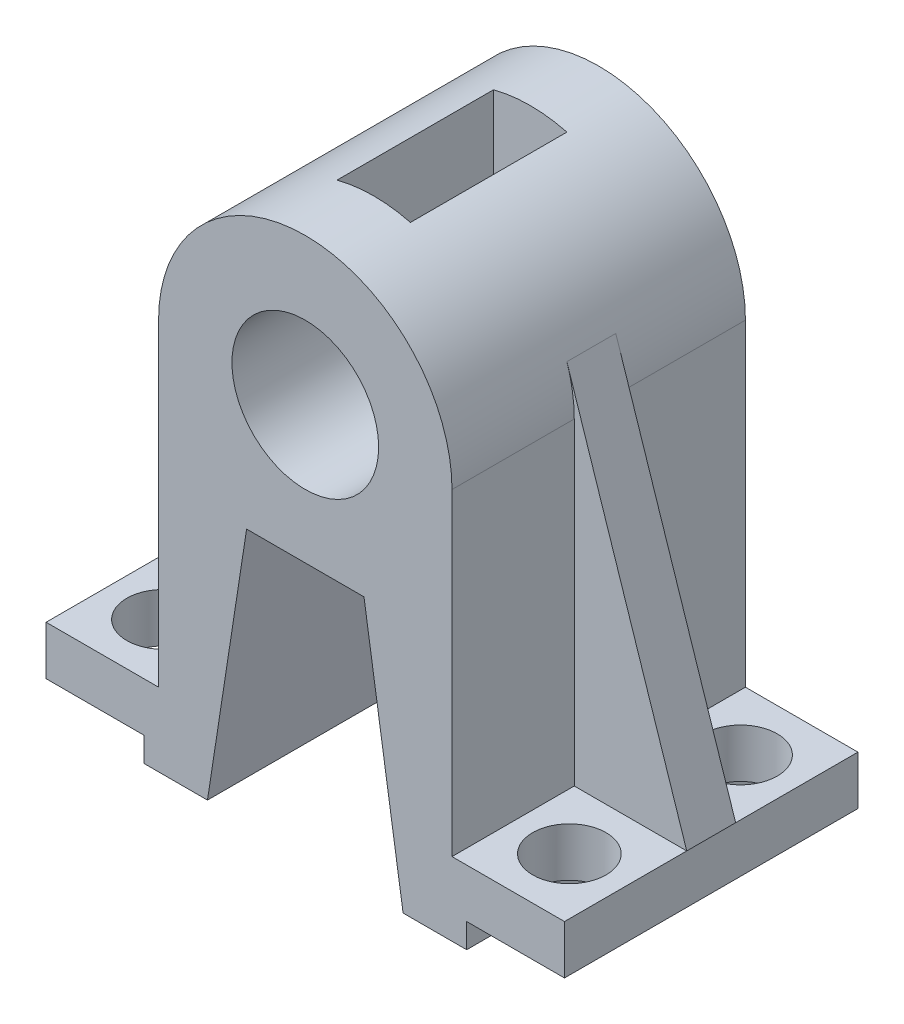
ISO-10303-21;
HEADER;
FILE_DESCRIPTION(('STEP AP214'),'2;1');
FILE_NAME('part.step','',(''),(''),'','','');
FILE_SCHEMA(('AUTOMOTIVE_DESIGN { 1 0 10303 214 1 1 1 1 }'));
ENDSEC;
DATA;
#1=APPLICATION_CONTEXT('core data for automotive mechanical design processes');
#2=APPLICATION_PROTOCOL_DEFINITION('international standard','automotive_design',2000,#1);
#3=PRODUCT_CONTEXT('',#1,'mechanical');
#4=PRODUCT('Part','Part','',(#3));
#5=PRODUCT_RELATED_PRODUCT_CATEGORY('part','',(#4));
#6=PRODUCT_DEFINITION_FORMATION('','',#4);
#7=PRODUCT_DEFINITION_CONTEXT('part definition',#1,'design');
#8=PRODUCT_DEFINITION('design','',#6,#7);
#9=PRODUCT_DEFINITION_SHAPE('','',#8);
#10=(LENGTH_UNIT() NAMED_UNIT(*) SI_UNIT(.MILLI.,.METRE.));
#11=(NAMED_UNIT(*) PLANE_ANGLE_UNIT() SI_UNIT($,.RADIAN.));
#12=(NAMED_UNIT(*) SI_UNIT($,.STERADIAN.) SOLID_ANGLE_UNIT());
#13=UNCERTAINTY_MEASURE_WITH_UNIT(LENGTH_MEASURE(1.E-05),#10,'distance_accuracy_value','');
#14=(GEOMETRIC_REPRESENTATION_CONTEXT(3) GLOBAL_UNCERTAINTY_ASSIGNED_CONTEXT((#13)) GLOBAL_UNIT_ASSIGNED_CONTEXT((#10,
#11,#12)) REPRESENTATION_CONTEXT('',''));
#15=CARTESIAN_POINT('',(0.,0.,0.));
#16=DIRECTION('',(0.,0.,1.));
#17=DIRECTION('',(1.,0.,0.));
#18=AXIS2_PLACEMENT_3D('',#15,#16,#17);
#19=CARTESIAN_POINT('',(-30.,15.,60.));
#20=DIRECTION('',(1.,0.,0.));
#21=DIRECTION('',(0.,0.,-1.));
#22=AXIS2_PLACEMENT_3D('',#19,#20,#21);
#23=PLANE('',#22);
#24=DIRECTION('',(0.,-1.,0.));
#25=VECTOR('',#24,1.);
#26=CARTESIAN_POINT('',(-30.,15.,25.));
#27=LINE('',#26,#25);
#28=CARTESIAN_POINT('',(-30.,80.,25.));
#29=VERTEX_POINT('',#28);
#30=CARTESIAN_POINT('',(-30.,15.,25.));
#31=VERTEX_POINT('',#30);
#32=EDGE_CURVE('E255',#29,#31,#27,.T.);
#33=ORIENTED_EDGE('',*,*,#32,.F.);
#34=DIRECTION('',(0.,0.,-1.));
#35=VECTOR('',#34,1.);
#36=CARTESIAN_POINT('',(-30.,80.,60.));
#37=LINE('',#36,#35);
#38=CARTESIAN_POINT('',(-30.,80.,0.));
#39=VERTEX_POINT('',#38);
#40=EDGE_CURVE('E252',#29,#39,#37,.T.);
#41=ORIENTED_EDGE('',*,*,#40,.T.);
#42=DIRECTION('',(0.,-1.,0.));
#43=VECTOR('',#42,1.);
#44=CARTESIAN_POINT('',(-30.,15.,0.));
#45=LINE('',#44,#43);
#46=CARTESIAN_POINT('',(-30.,15.,0.));
#47=VERTEX_POINT('',#46);
#48=EDGE_CURVE('E433',#39,#47,#45,.T.);
#49=ORIENTED_EDGE('',*,*,#48,.T.);
#50=DIRECTION('',(0.,0.,-1.));
#51=VECTOR('',#50,1.);
#52=CARTESIAN_POINT('',(-30.,15.,60.));
#53=LINE('',#52,#51);
#54=EDGE_CURVE('E507',#31,#47,#53,.T.);
#55=ORIENTED_EDGE('',*,*,#54,.F.);
#56=EDGE_LOOP('',(#33,#41,#49,#55));
#57=FACE_BOUND('',#56,.T.);
#58=ADVANCED_FACE('F45',(#57),#23,.F.);
#59=CARTESIAN_POINT('',(-53.,15.,60.));
#60=DIRECTION('',(0.,-1.,0.));
#61=DIRECTION('',(1.,0.,0.));
#62=AXIS2_PLACEMENT_3D('',#59,#60,#61);
#63=PLANE('',#62);
#64=CARTESIAN_POINT('',(-41.5,15.,12.5));
#65=DIRECTION('',(0.,1.,0.));
#66=DIRECTION('',(-1.,0.,0.));
#67=AXIS2_PLACEMENT_3D('',#64,#65,#66);
#68=CIRCLE('',#67,7.5);
#69=CARTESIAN_POINT('',(-49.,15.,12.5));
#70=VERTEX_POINT('',#69);
#71=EDGE_CURVE('E334',#70,#70,#68,.T.);
#72=ORIENTED_EDGE('',*,*,#71,.F.);
#73=EDGE_LOOP('',(#72));
#74=FACE_BOUND('',#73,.T.);
#75=DIRECTION('',(-1.,0.,0.));
#76=VECTOR('',#75,1.);
#77=CARTESIAN_POINT('',(-53.,15.,25.));
#78=LINE('',#77,#76);
#79=CARTESIAN_POINT('',(-53.,15.,25.));
#80=VERTEX_POINT('',#79);
#81=EDGE_CURVE('E245',#31,#80,#78,.T.);
#82=ORIENTED_EDGE('',*,*,#81,.F.);
#83=ORIENTED_EDGE('',*,*,#54,.T.);
#84=DIRECTION('',(-1.,0.,0.));
#85=VECTOR('',#84,1.);
#86=CARTESIAN_POINT('',(-53.,15.,0.));
#87=LINE('',#86,#85);
#88=CARTESIAN_POINT('',(-53.,15.,0.));
#89=VERTEX_POINT('',#88);
#90=EDGE_CURVE('E437',#47,#89,#87,.T.);
#91=ORIENTED_EDGE('',*,*,#90,.T.);
#92=DIRECTION('',(0.,0.,-1.));
#93=VECTOR('',#92,1.);
#94=CARTESIAN_POINT('',(-53.,15.,60.));
#95=LINE('',#94,#93);
#96=EDGE_CURVE('E502',#80,#89,#95,.T.);
#97=ORIENTED_EDGE('',*,*,#96,.F.);
#98=EDGE_LOOP('',(#82,#83,#91,#97));
#99=FACE_BOUND('',#98,.T.);
#100=ADVANCED_FACE('F586',(#74,#99),#63,.F.);
#101=CARTESIAN_POINT('',(53.,15.,60.));
#102=DIRECTION('',(0.,-1.,0.));
#103=DIRECTION('',(1.,0.,0.));
#104=AXIS2_PLACEMENT_3D('',#101,#102,#103);
#105=PLANE('',#104);
#106=CARTESIAN_POINT('',(41.5,15.,12.5));
#107=DIRECTION('',(0.,1.,0.));
#108=DIRECTION('',(1.,0.,0.));
#109=AXIS2_PLACEMENT_3D('',#106,#107,#108);
#110=CIRCLE('',#109,7.5);
#111=CARTESIAN_POINT('',(49.,15.,12.5));
#112=VERTEX_POINT('',#111);
#113=EDGE_CURVE('E329',#112,#112,#110,.T.);
#114=ORIENTED_EDGE('',*,*,#113,.F.);
#115=EDGE_LOOP('',(#114));
#116=FACE_BOUND('',#115,.T.);
#117=DIRECTION('',(-1.,0.,0.));
#118=VECTOR('',#117,1.);
#119=CARTESIAN_POINT('',(53.,15.,25.));
#120=LINE('',#119,#118);
#121=CARTESIAN_POINT('',(53.,15.,25.));
#122=VERTEX_POINT('',#121);
#123=CARTESIAN_POINT('',(30.,15.,25.));
#124=VERTEX_POINT('',#123);
#125=EDGE_CURVE('E287',#122,#124,#120,.T.);
#126=ORIENTED_EDGE('',*,*,#125,.F.);
#127=DIRECTION('',(0.,0.,-1.));
#128=VECTOR('',#127,1.);
#129=CARTESIAN_POINT('',(53.,15.,60.));
#130=LINE('',#129,#128);
#131=CARTESIAN_POINT('',(53.,15.,0.));
#132=VERTEX_POINT('',#131);
#133=EDGE_CURVE('E526',#122,#132,#130,.T.);
#134=ORIENTED_EDGE('',*,*,#133,.T.);
#135=DIRECTION('',(-1.,0.,0.));
#136=VECTOR('',#135,1.);
#137=CARTESIAN_POINT('',(53.,15.,0.));
#138=LINE('',#137,#136);
#139=CARTESIAN_POINT('',(30.,15.,0.));
#140=VERTEX_POINT('',#139);
#141=EDGE_CURVE('E422',#132,#140,#138,.T.);
#142=ORIENTED_EDGE('',*,*,#141,.T.);
#143=DIRECTION('',(0.,0.,-1.));
#144=VECTOR('',#143,1.);
#145=CARTESIAN_POINT('',(30.,15.,60.));
#146=LINE('',#145,#144);
#147=EDGE_CURVE('E521',#124,#140,#146,.T.);
#148=ORIENTED_EDGE('',*,*,#147,.F.);
#149=EDGE_LOOP('',(#126,#134,#142,#148));
#150=FACE_BOUND('',#149,.T.);
#151=ADVANCED_FACE('F594',(#116,#150),#105,.F.);
#152=CARTESIAN_POINT('',(30.,15.,60.));
#153=DIRECTION('',(-1.,0.,0.));
#154=DIRECTION('',(0.,0.,1.));
#155=AXIS2_PLACEMENT_3D('',#152,#153,#154);
#156=PLANE('',#155);
#157=DIRECTION('',(0.,1.,0.));
#158=VECTOR('',#157,1.);
#159=CARTESIAN_POINT('',(30.,15.,25.));
#160=LINE('',#159,#158);
#161=CARTESIAN_POINT('',(30.,80.,25.));
#162=VERTEX_POINT('',#161);
#163=EDGE_CURVE('E283',#124,#162,#160,.T.);
#164=ORIENTED_EDGE('',*,*,#163,.F.);
#165=ORIENTED_EDGE('',*,*,#147,.T.);
#166=DIRECTION('',(0.,1.,0.));
#167=VECTOR('',#166,1.);
#168=CARTESIAN_POINT('',(30.,15.,0.));
#169=LINE('',#168,#167);
#170=CARTESIAN_POINT('',(30.,80.,0.));
#171=VERTEX_POINT('',#170);
#172=EDGE_CURVE('E426',#140,#171,#169,.T.);
#173=ORIENTED_EDGE('',*,*,#172,.T.);
#174=DIRECTION('',(0.,0.,-1.));
#175=VECTOR('',#174,1.);
#176=CARTESIAN_POINT('',(30.,80.,60.));
#177=LINE('',#176,#175);
#178=EDGE_CURVE('E517',#162,#171,#177,.T.);
#179=ORIENTED_EDGE('',*,*,#178,.F.);
#180=EDGE_LOOP('',(#164,#165,#173,#179));
#181=FACE_BOUND('',#180,.T.);
#182=ADVANCED_FACE('F612',(#181),#156,.F.);
#183=CARTESIAN_POINT('',(0.,80.,60.));
#184=DIRECTION('',(0.,0.,-1.));
#185=DIRECTION('',(-1.,0.,0.));
#186=AXIS2_PLACEMENT_3D('',#183,#184,#185);
#187=CYLINDRICAL_SURFACE('',#186,30.);
#188=CARTESIAN_POINT('',(0.,80.,14.));
#189=DIRECTION('',(0.,0.,1.));
#190=DIRECTION('',(1.,0.,0.));
#191=AXIS2_PLACEMENT_3D('',#188,#189,#190);
#192=CIRCLE('',#191,30.);
#193=CARTESIAN_POINT('',(7.5,109.047375096556,14.));
#194=VERTEX_POINT('',#193);
#195=CARTESIAN_POINT('',(-7.5,109.047375096556,14.));
#196=VERTEX_POINT('',#195);
#197=EDGE_CURVE('E317',#194,#196,#192,.T.);
#198=ORIENTED_EDGE('',*,*,#197,.F.);
#199=DIRECTION('',(0.,0.,-1.));
#200=VECTOR('',#199,1.);
#201=CARTESIAN_POINT('',(7.5,109.047375096556,60.));
#202=LINE('',#201,#200);
#203=CARTESIAN_POINT('',(7.5,109.047375096556,46.));
#204=VERTEX_POINT('',#203);
#205=EDGE_CURVE('E320',#204,#194,#202,.T.);
#206=ORIENTED_EDGE('',*,*,#205,.F.);
#207=CARTESIAN_POINT('',(0.,80.,46.));
#208=DIRECTION('',(0.,0.,-1.));
#209=DIRECTION('',(-1.,0.,0.));
#210=AXIS2_PLACEMENT_3D('',#207,#208,#209);
#211=CIRCLE('',#210,30.);
#212=CARTESIAN_POINT('',(-7.5,109.047375096556,46.));
#213=VERTEX_POINT('',#212);
#214=EDGE_CURVE('E323',#213,#204,#211,.T.);
#215=ORIENTED_EDGE('',*,*,#214,.F.);
#216=DIRECTION('',(0.,0.,-1.));
#217=VECTOR('',#216,1.);
#218=CARTESIAN_POINT('',(-7.5,109.047375096556,60.));
#219=LINE('',#218,#217);
#220=EDGE_CURVE('E326',#196,#213,#219,.F.);
#221=ORIENTED_EDGE('',*,*,#220,.F.);
#222=EDGE_LOOP('',(#198,#206,#215,#221));
#223=FACE_BOUND('',#222,.T.);
#224=CARTESIAN_POINT('',(0.,80.,35.));
#225=DIRECTION('',(0.,0.,1.));
#226=DIRECTION('',(1.,0.,0.));
#227=AXIS2_PLACEMENT_3D('',#224,#225,#226);
#228=CIRCLE('',#227,30.);
#229=CARTESIAN_POINT('',(30.,80.,35.));
#230=VERTEX_POINT('',#229);
#231=CARTESIAN_POINT('',(28.493562858085,89.3870589458232,35.));
#232=VERTEX_POINT('',#231);
#233=EDGE_CURVE('E69',#230,#232,#228,.T.);
#234=ORIENTED_EDGE('',*,*,#233,.T.);
#235=DIRECTION('',(0.,0.,-1.));
#236=VECTOR('',#235,1.);
#237=CARTESIAN_POINT('',(28.493562858085,89.3870589458232,60.));
#238=LINE('',#237,#236);
#239=CARTESIAN_POINT('',(28.493562858085,89.3870589458232,25.));
#240=VERTEX_POINT('',#239);
#241=EDGE_CURVE('E299',#240,#232,#238,.F.);
#242=ORIENTED_EDGE('',*,*,#241,.F.);
#243=CARTESIAN_POINT('',(0.,80.,25.));
#244=DIRECTION('',(0.,0.,1.));
#245=DIRECTION('',(1.,0.,0.));
#246=AXIS2_PLACEMENT_3D('',#243,#244,#245);
#247=CIRCLE('',#246,30.);
#248=EDGE_CURVE('E276',#162,#240,#247,.T.);
#249=ORIENTED_EDGE('',*,*,#248,.F.);
#250=ORIENTED_EDGE('',*,*,#178,.T.);
#251=CARTESIAN_POINT('',(0.,80.,0.));
#252=DIRECTION('',(0.,0.,1.));
#253=DIRECTION('',(1.,0.,0.));
#254=AXIS2_PLACEMENT_3D('',#251,#252,#253);
#255=CIRCLE('',#254,30.);
#256=EDGE_CURVE('E430',#171,#39,#255,.T.);
#257=ORIENTED_EDGE('',*,*,#256,.T.);
#258=ORIENTED_EDGE('',*,*,#40,.F.);
#259=CARTESIAN_POINT('',(0.,80.,25.));
#260=DIRECTION('',(0.,0.,1.));
#261=DIRECTION('',(1.,0.,0.));
#262=AXIS2_PLACEMENT_3D('',#259,#260,#261);
#263=CIRCLE('',#262,30.);
#264=CARTESIAN_POINT('',(-28.493562858085,89.3870589458232,25.));
#265=VERTEX_POINT('',#264);
#266=EDGE_CURVE('E242',#265,#29,#263,.T.);
#267=ORIENTED_EDGE('',*,*,#266,.F.);
#268=DIRECTION('',(0.,0.,-1.));
#269=VECTOR('',#268,1.);
#270=CARTESIAN_POINT('',(-28.493562858085,89.3870589458232,60.));
#271=LINE('',#270,#269);
#272=CARTESIAN_POINT('',(-28.493562858085,89.3870589458232,35.));
#273=VERTEX_POINT('',#272);
#274=EDGE_CURVE('E230',#273,#265,#271,.T.);
#275=ORIENTED_EDGE('',*,*,#274,.F.);
#276=CARTESIAN_POINT('',(0.,80.,35.));
#277=DIRECTION('',(0.,0.,1.));
#278=DIRECTION('',(1.,0.,0.));
#279=AXIS2_PLACEMENT_3D('',#276,#277,#278);
#280=CIRCLE('',#279,30.);
#281=CARTESIAN_POINT('',(-30.,80.,35.));
#282=VERTEX_POINT('',#281);
#283=EDGE_CURVE('E254',#273,#282,#280,.T.);
#284=ORIENTED_EDGE('',*,*,#283,.T.);
#285=CARTESIAN_POINT('',(-30.,80.,60.));
#286=VERTEX_POINT('',#285);
#287=EDGE_CURVE('E513',#286,#282,#37,.T.);
#288=ORIENTED_EDGE('',*,*,#287,.F.);
#289=CARTESIAN_POINT('',(0.,80.,60.));
#290=DIRECTION('',(0.,0.,1.));
#291=DIRECTION('',(1.,0.,0.));
#292=AXIS2_PLACEMENT_3D('',#289,#290,#291);
#293=CIRCLE('',#292,30.);
#294=CARTESIAN_POINT('',(30.,80.,60.));
#295=VERTEX_POINT('',#294);
#296=EDGE_CURVE('E378',#295,#286,#293,.T.);
#297=ORIENTED_EDGE('',*,*,#296,.F.);
#298=EDGE_CURVE('E518',#295,#230,#177,.T.);
#299=ORIENTED_EDGE('',*,*,#298,.T.);
#300=EDGE_LOOP('',(#234,#242,#249,#250,#257,#258,#267,#275,#284,#288,#297,#299));
#301=FACE_BOUND('',#300,.T.);
#302=ADVANCED_FACE('F250',(#223,#301),#187,.T.);
#303=CARTESIAN_POINT('',(0.,80.,60.));
#304=DIRECTION('',(0.,0.,-1.));
#305=DIRECTION('',(-1.,0.,0.));
#306=AXIS2_PLACEMENT_3D('',#303,#304,#305);
#307=CYLINDRICAL_SURFACE('',#306,15.);
#308=DIRECTION('',(0.,0.,-1.));
#309=VECTOR('',#308,1.);
#310=CARTESIAN_POINT('',(7.5,92.9903810567666,60.));
#311=LINE('',#310,#309);
#312=CARTESIAN_POINT('',(7.5,92.9903810567666,46.));
#313=VERTEX_POINT('',#312);
#314=CARTESIAN_POINT('',(7.5,92.9903810567666,14.));
#315=VERTEX_POINT('',#314);
#316=EDGE_CURVE('E545',#313,#315,#311,.T.);
#317=ORIENTED_EDGE('',*,*,#316,.T.);
#318=CARTESIAN_POINT('',(0.,80.,14.));
#319=DIRECTION('',(0.,0.,1.));
#320=DIRECTION('',(1.,0.,0.));
#321=AXIS2_PLACEMENT_3D('',#318,#319,#320);
#322=CIRCLE('',#321,15.);
#323=CARTESIAN_POINT('',(-7.5,92.9903810567666,14.));
#324=VERTEX_POINT('',#323);
#325=EDGE_CURVE('E535',#315,#324,#322,.T.);
#326=ORIENTED_EDGE('',*,*,#325,.T.);
#327=DIRECTION('',(0.,0.,-1.));
#328=VECTOR('',#327,1.);
#329=CARTESIAN_POINT('',(-7.5,92.9903810567666,60.));
#330=LINE('',#329,#328);
#331=CARTESIAN_POINT('',(-7.5,92.9903810567666,46.));
#332=VERTEX_POINT('',#331);
#333=EDGE_CURVE('E11',#324,#332,#330,.F.);
#334=ORIENTED_EDGE('',*,*,#333,.T.);
#335=CARTESIAN_POINT('',(0.,80.,46.));
#336=DIRECTION('',(0.,0.,-1.));
#337=DIRECTION('',(-1.,0.,0.));
#338=AXIS2_PLACEMENT_3D('',#335,#336,#337);
#339=CIRCLE('',#338,15.);
#340=EDGE_CURVE('E54',#332,#313,#339,.T.);
#341=ORIENTED_EDGE('',*,*,#340,.T.);
#342=EDGE_LOOP('',(#317,#326,#334,#341));
#343=FACE_BOUND('',#342,.T.);
#344=CARTESIAN_POINT('',(0.,80.,60.));
#345=DIRECTION('',(0.,0.,1.));
#346=DIRECTION('',(1.,0.,0.));
#347=AXIS2_PLACEMENT_3D('',#344,#345,#346);
#348=CIRCLE('',#347,15.);
#349=CARTESIAN_POINT('',(15.,80.,60.));
#350=VERTEX_POINT('',#349);
#351=EDGE_CURVE('E356',#350,#350,#348,.T.);
#352=ORIENTED_EDGE('',*,*,#351,.T.);
#353=EDGE_LOOP('',(#352));
#354=FACE_BOUND('',#353,.T.);
#355=CARTESIAN_POINT('',(0.,80.,0.));
#356=DIRECTION('',(0.,0.,1.));
#357=DIRECTION('',(1.,0.,0.));
#358=AXIS2_PLACEMENT_3D('',#355,#356,#357);
#359=CIRCLE('',#358,15.);
#360=CARTESIAN_POINT('',(15.,80.,0.));
#361=VERTEX_POINT('',#360);
#362=EDGE_CURVE('E355',#361,#361,#359,.T.);
#363=ORIENTED_EDGE('',*,*,#362,.F.);
#364=EDGE_LOOP('',(#363));
#365=FACE_BOUND('',#364,.T.);
#366=ADVANCED_FACE('F551',(#343,#354,#365),#307,.F.);
#367=CARTESIAN_POINT('',(0.,80.,60.));
#368=DIRECTION('',(0.,0.,1.));
#369=DIRECTION('',(1.,0.,0.));
#370=AXIS2_PLACEMENT_3D('',#367,#368,#369);
#371=PLANE('',#370);
#372=DIRECTION('',(1.,0.,0.));
#373=VECTOR('',#372,1.);
#374=CARTESIAN_POINT('',(33.,5.,60.));
#375=LINE('',#374,#373);
#376=CARTESIAN_POINT('',(33.,5.,60.));
#377=VERTEX_POINT('',#376);
#378=CARTESIAN_POINT('',(53.,5.,60.));
#379=VERTEX_POINT('',#378);
#380=EDGE_CURVE('E364',#377,#379,#375,.T.);
#381=ORIENTED_EDGE('',*,*,#380,.T.);
#382=DIRECTION('',(0.,1.,0.));
#383=VECTOR('',#382,1.);
#384=CARTESIAN_POINT('',(53.,5.,60.));
#385=LINE('',#384,#383);
#386=CARTESIAN_POINT('',(53.,15.,60.));
#387=VERTEX_POINT('',#386);
#388=EDGE_CURVE('E368',#379,#387,#385,.T.);
#389=ORIENTED_EDGE('',*,*,#388,.T.);
#390=DIRECTION('',(-1.,0.,0.));
#391=VECTOR('',#390,1.);
#392=CARTESIAN_POINT('',(53.,15.,60.));
#393=LINE('',#392,#391);
#394=CARTESIAN_POINT('',(30.,15.,60.));
#395=VERTEX_POINT('',#394);
#396=EDGE_CURVE('E372',#387,#395,#393,.T.);
#397=ORIENTED_EDGE('',*,*,#396,.T.);
#398=DIRECTION('',(0.,1.,0.));
#399=VECTOR('',#398,1.);
#400=CARTESIAN_POINT('',(30.,15.,60.));
#401=LINE('',#400,#399);
#402=EDGE_CURVE('E375',#395,#295,#401,.T.);
#403=ORIENTED_EDGE('',*,*,#402,.T.);
#404=ORIENTED_EDGE('',*,*,#296,.T.);
#405=DIRECTION('',(0.,-1.,0.));
#406=VECTOR('',#405,1.);
#407=CARTESIAN_POINT('',(-30.,15.,60.));
#408=LINE('',#407,#406);
#409=CARTESIAN_POINT('',(-30.,15.,60.));
#410=VERTEX_POINT('',#409);
#411=EDGE_CURVE('E381',#286,#410,#408,.T.);
#412=ORIENTED_EDGE('',*,*,#411,.T.);
#413=DIRECTION('',(-1.,0.,0.));
#414=VECTOR('',#413,1.);
#415=CARTESIAN_POINT('',(-53.,15.,60.));
#416=LINE('',#415,#414);
#417=CARTESIAN_POINT('',(-53.,15.,60.));
#418=VERTEX_POINT('',#417);
#419=EDGE_CURVE('E384',#410,#418,#416,.T.);
#420=ORIENTED_EDGE('',*,*,#419,.T.);
#421=DIRECTION('',(0.,-1.,0.));
#422=VECTOR('',#421,1.);
#423=CARTESIAN_POINT('',(-53.,5.00000000000001,60.));
#424=LINE('',#423,#422);
#425=CARTESIAN_POINT('',(-53.,5.00000000000001,60.));
#426=VERTEX_POINT('',#425);
#427=EDGE_CURVE('E387',#418,#426,#424,.T.);
#428=ORIENTED_EDGE('',*,*,#427,.T.);
#429=DIRECTION('',(1.,0.,0.));
#430=VECTOR('',#429,1.);
#431=CARTESIAN_POINT('',(-33.,5.,60.));
#432=LINE('',#431,#430);
#433=CARTESIAN_POINT('',(-33.,5.,60.));
#434=VERTEX_POINT('',#433);
#435=EDGE_CURVE('E390',#426,#434,#432,.T.);
#436=ORIENTED_EDGE('',*,*,#435,.T.);
#437=DIRECTION('',(0.,-1.,0.));
#438=VECTOR('',#437,1.);
#439=CARTESIAN_POINT('',(-33.,0.,60.));
#440=LINE('',#439,#438);
#441=CARTESIAN_POINT('',(-33.,0.,60.));
#442=VERTEX_POINT('',#441);
#443=EDGE_CURVE('E393',#434,#442,#440,.T.);
#444=ORIENTED_EDGE('',*,*,#443,.T.);
#445=DIRECTION('',(1.,0.,0.));
#446=VECTOR('',#445,1.);
#447=CARTESIAN_POINT('',(-20.,0.,60.));
#448=LINE('',#447,#446);
#449=CARTESIAN_POINT('',(-20.,0.,60.));
#450=VERTEX_POINT('',#449);
#451=EDGE_CURVE('E396',#442,#450,#448,.T.);
#452=ORIENTED_EDGE('',*,*,#451,.T.);
#453=DIRECTION('',(0.152057184253941,0.988371697650617,0.));
#454=VECTOR('',#453,1.);
#455=CARTESIAN_POINT('',(-12.,52.,60.));
#456=LINE('',#455,#454);
#457=CARTESIAN_POINT('',(-12.,52.,60.));
#458=VERTEX_POINT('',#457);
#459=EDGE_CURVE('E399',#450,#458,#456,.T.);
#460=ORIENTED_EDGE('',*,*,#459,.T.);
#461=DIRECTION('',(1.,0.,0.));
#462=VECTOR('',#461,1.);
#463=CARTESIAN_POINT('',(-12.,52.,60.));
#464=LINE('',#463,#462);
#465=CARTESIAN_POINT('',(12.,52.,60.));
#466=VERTEX_POINT('',#465);
#467=EDGE_CURVE('E402',#458,#466,#464,.T.);
#468=ORIENTED_EDGE('',*,*,#467,.T.);
#469=DIRECTION('',(0.152057184253941,-0.988371697650617,0.));
#470=VECTOR('',#469,1.);
#471=CARTESIAN_POINT('',(12.,52.,60.));
#472=LINE('',#471,#470);
#473=CARTESIAN_POINT('',(20.,0.,60.));
#474=VERTEX_POINT('',#473);
#475=EDGE_CURVE('E405',#466,#474,#472,.T.);
#476=ORIENTED_EDGE('',*,*,#475,.T.);
#477=DIRECTION('',(1.,0.,0.));
#478=VECTOR('',#477,1.);
#479=CARTESIAN_POINT('',(20.,0.,60.));
#480=LINE('',#479,#478);
#481=CARTESIAN_POINT('',(33.,0.,60.));
#482=VERTEX_POINT('',#481);
#483=EDGE_CURVE('E408',#474,#482,#480,.T.);
#484=ORIENTED_EDGE('',*,*,#483,.T.);
#485=DIRECTION('',(0.,1.,0.));
#486=VECTOR('',#485,1.);
#487=CARTESIAN_POINT('',(33.,0.,60.));
#488=LINE('',#487,#486);
#489=EDGE_CURVE('E411',#482,#377,#488,.T.);
#490=ORIENTED_EDGE('',*,*,#489,.T.);
#491=EDGE_LOOP('',(#381,#389,#397,#403,#404,#412,#420,#428,#436,#444,#452,#460,#468,#476,#484,#490));
#492=FACE_BOUND('',#491,.T.);
#493=ORIENTED_EDGE('',*,*,#351,.F.);
#494=EDGE_LOOP('',(#493));
#495=FACE_BOUND('',#494,.T.);
#496=ADVANCED_FACE('F628',(#492,#495),#371,.T.);
#497=CARTESIAN_POINT('',(0.,80.,0.));
#498=DIRECTION('',(0.,0.,1.));
#499=DIRECTION('',(1.,0.,0.));
#500=AXIS2_PLACEMENT_3D('',#497,#498,#499);
#501=PLANE('',#500);
#502=DIRECTION('',(1.,0.,0.));
#503=VECTOR('',#502,1.);
#504=CARTESIAN_POINT('',(33.,5.,0.));
#505=LINE('',#504,#503);
#506=CARTESIAN_POINT('',(33.,5.,0.));
#507=VERTEX_POINT('',#506);
#508=CARTESIAN_POINT('',(53.,5.,0.));
#509=VERTEX_POINT('',#508);
#510=EDGE_CURVE('E360',#507,#509,#505,.T.);
#511=ORIENTED_EDGE('',*,*,#510,.F.);
#512=DIRECTION('',(0.,1.,0.));
#513=VECTOR('',#512,1.);
#514=CARTESIAN_POINT('',(33.,0.,0.));
#515=LINE('',#514,#513);
#516=CARTESIAN_POINT('',(33.,0.,0.));
#517=VERTEX_POINT('',#516);
#518=EDGE_CURVE('E369',#517,#507,#515,.T.);
#519=ORIENTED_EDGE('',*,*,#518,.F.);
#520=DIRECTION('',(1.,0.,0.));
#521=VECTOR('',#520,1.);
#522=CARTESIAN_POINT('',(20.,0.,0.));
#523=LINE('',#522,#521);
#524=CARTESIAN_POINT('',(20.,0.,0.));
#525=VERTEX_POINT('',#524);
#526=EDGE_CURVE('E469',#525,#517,#523,.T.);
#527=ORIENTED_EDGE('',*,*,#526,.F.);
#528=DIRECTION('',(0.152057184253941,-0.988371697650617,0.));
#529=VECTOR('',#528,1.);
#530=CARTESIAN_POINT('',(12.,52.,0.));
#531=LINE('',#530,#529);
#532=CARTESIAN_POINT('',(12.,52.,0.));
#533=VERTEX_POINT('',#532);
#534=EDGE_CURVE('E465',#533,#525,#531,.T.);
#535=ORIENTED_EDGE('',*,*,#534,.F.);
#536=DIRECTION('',(1.,0.,0.));
#537=VECTOR('',#536,1.);
#538=CARTESIAN_POINT('',(-12.,52.,0.));
#539=LINE('',#538,#537);
#540=CARTESIAN_POINT('',(-12.,52.,0.));
#541=VERTEX_POINT('',#540);
#542=EDGE_CURVE('E461',#541,#533,#539,.T.);
#543=ORIENTED_EDGE('',*,*,#542,.F.);
#544=DIRECTION('',(0.152057184253941,0.988371697650617,0.));
#545=VECTOR('',#544,1.);
#546=CARTESIAN_POINT('',(-12.,52.,0.));
#547=LINE('',#546,#545);
#548=CARTESIAN_POINT('',(-20.,0.,0.));
#549=VERTEX_POINT('',#548);
#550=EDGE_CURVE('E457',#549,#541,#547,.T.);
#551=ORIENTED_EDGE('',*,*,#550,.F.);
#552=DIRECTION('',(1.,0.,0.));
#553=VECTOR('',#552,1.);
#554=CARTESIAN_POINT('',(-20.,0.,0.));
#555=LINE('',#554,#553);
#556=CARTESIAN_POINT('',(-33.,0.,0.));
#557=VERTEX_POINT('',#556);
#558=EDGE_CURVE('E453',#557,#549,#555,.T.);
#559=ORIENTED_EDGE('',*,*,#558,.F.);
#560=DIRECTION('',(0.,-1.,0.));
#561=VECTOR('',#560,1.);
#562=CARTESIAN_POINT('',(-33.,0.,0.));
#563=LINE('',#562,#561);
#564=CARTESIAN_POINT('',(-33.,5.,0.));
#565=VERTEX_POINT('',#564);
#566=EDGE_CURVE('E449',#565,#557,#563,.T.);
#567=ORIENTED_EDGE('',*,*,#566,.F.);
#568=DIRECTION('',(1.,0.,0.));
#569=VECTOR('',#568,1.);
#570=CARTESIAN_POINT('',(-33.,5.,0.));
#571=LINE('',#570,#569);
#572=CARTESIAN_POINT('',(-53.,5.00000000000001,0.));
#573=VERTEX_POINT('',#572);
#574=EDGE_CURVE('E445',#573,#565,#571,.T.);
#575=ORIENTED_EDGE('',*,*,#574,.F.);
#576=DIRECTION('',(0.,-1.,0.));
#577=VECTOR('',#576,1.);
#578=CARTESIAN_POINT('',(-53.,5.00000000000001,0.));
#579=LINE('',#578,#577);
#580=EDGE_CURVE('E441',#89,#573,#579,.T.);
#581=ORIENTED_EDGE('',*,*,#580,.F.);
#582=ORIENTED_EDGE('',*,*,#90,.F.);
#583=ORIENTED_EDGE('',*,*,#48,.F.);
#584=ORIENTED_EDGE('',*,*,#256,.F.);
#585=ORIENTED_EDGE('',*,*,#172,.F.);
#586=ORIENTED_EDGE('',*,*,#141,.F.);
#587=DIRECTION('',(0.,1.,0.));
#588=VECTOR('',#587,1.);
#589=CARTESIAN_POINT('',(53.,5.,0.));
#590=LINE('',#589,#588);
#591=EDGE_CURVE('E418',#509,#132,#590,.T.);
#592=ORIENTED_EDGE('',*,*,#591,.F.);
#593=EDGE_LOOP('',(#511,#519,#527,#535,#543,#551,#559,#567,#575,#581,#582,#583,#584,#585,#586,#592));
#594=FACE_BOUND('',#593,.T.);
#595=ORIENTED_EDGE('',*,*,#362,.T.);
#596=EDGE_LOOP('',(#595));
#597=FACE_BOUND('',#596,.T.);
#598=ADVANCED_FACE('F665',(#594,#597),#501,.F.);
#599=CARTESIAN_POINT('',(33.,5.,60.));
#600=DIRECTION('',(0.,1.,0.));
#601=DIRECTION('',(0.,0.,1.));
#602=AXIS2_PLACEMENT_3D('',#599,#600,#601);
#603=PLANE('',#602);
#604=CARTESIAN_POINT('',(41.5,5.,47.5));
#605=DIRECTION('',(0.,1.,0.));
#606=DIRECTION('',(0.,0.,1.));
#607=AXIS2_PLACEMENT_3D('',#604,#605,#606);
#608=CIRCLE('',#607,7.5);
#609=CARTESIAN_POINT('',(41.5,5.,55.));
#610=VERTEX_POINT('',#609);
#611=EDGE_CURVE('E346',#610,#610,#608,.T.);
#612=ORIENTED_EDGE('',*,*,#611,.T.);
#613=EDGE_LOOP('',(#612));
#614=FACE_BOUND('',#613,.T.);
#615=DIRECTION('',(0.,0.,-1.));
#616=VECTOR('',#615,1.);
#617=CARTESIAN_POINT('',(33.,5.,60.));
#618=LINE('',#617,#616);
#619=EDGE_CURVE('E414',#377,#507,#618,.T.);
#620=ORIENTED_EDGE('',*,*,#619,.T.);
#621=ORIENTED_EDGE('',*,*,#510,.T.);
#622=DIRECTION('',(0.,0.,-1.));
#623=VECTOR('',#622,1.);
#624=CARTESIAN_POINT('',(53.,5.,60.));
#625=LINE('',#624,#623);
#626=EDGE_CURVE('E531',#379,#509,#625,.T.);
#627=ORIENTED_EDGE('',*,*,#626,.F.);
#628=ORIENTED_EDGE('',*,*,#380,.F.);
#629=EDGE_LOOP('',(#620,#621,#627,#628));
#630=FACE_BOUND('',#629,.T.);
#631=CARTESIAN_POINT('',(41.5,5.,12.5));
#632=DIRECTION('',(0.,1.,0.));
#633=DIRECTION('',(0.,0.,1.));
#634=AXIS2_PLACEMENT_3D('',#631,#632,#633);
#635=CIRCLE('',#634,7.5);
#636=CARTESIAN_POINT('',(41.5,5.,20.));
#637=VERTEX_POINT('',#636);
#638=EDGE_CURVE('E350',#637,#637,#635,.T.);
#639=ORIENTED_EDGE('',*,*,#638,.T.);
#640=EDGE_LOOP('',(#639));
#641=FACE_BOUND('',#640,.T.);
#642=ADVANCED_FACE('F47',(#614,#630,#641),#603,.F.);
#643=CARTESIAN_POINT('',(53.,5.,60.));
#644=DIRECTION('',(-1.,0.,0.));
#645=DIRECTION('',(0.,0.,1.));
#646=AXIS2_PLACEMENT_3D('',#643,#644,#645);
#647=PLANE('',#646);
#648=ORIENTED_EDGE('',*,*,#626,.T.);
#649=ORIENTED_EDGE('',*,*,#591,.T.);
#650=ORIENTED_EDGE('',*,*,#133,.F.);
#651=CARTESIAN_POINT('',(53.,15.,35.));
#652=VERTEX_POINT('',#651);
#653=EDGE_CURVE('E532',#652,#122,#130,.T.);
#654=ORIENTED_EDGE('',*,*,#653,.F.);
#655=EDGE_CURVE('E527',#387,#652,#130,.T.);
#656=ORIENTED_EDGE('',*,*,#655,.F.);
#657=ORIENTED_EDGE('',*,*,#388,.F.);
#658=EDGE_LOOP('',(#648,#649,#650,#654,#656,#657));
#659=FACE_BOUND('',#658,.T.);
#660=ADVANCED_FACE('F712',(#659),#647,.F.);
#661=CARTESIAN_POINT('',(41.5,15.,47.5));
#662=DIRECTION('',(0.,1.,0.));
#663=DIRECTION('',(1.,0.,0.));
#664=AXIS2_PLACEMENT_3D('',#661,#662,#663);
#665=CIRCLE('',#664,7.5);
#666=CARTESIAN_POINT('',(49.,15.,47.5));
#667=VERTEX_POINT('',#666);
#668=EDGE_CURVE('E335',#667,#667,#665,.T.);
#669=ORIENTED_EDGE('',*,*,#668,.F.);
#670=EDGE_LOOP('',(#669));
#671=FACE_BOUND('',#670,.T.);
#672=ORIENTED_EDGE('',*,*,#655,.T.);
#673=DIRECTION('',(-1.,0.,0.));
#674=VECTOR('',#673,1.);
#675=CARTESIAN_POINT('',(53.,15.,35.));
#676=LINE('',#675,#674);
#677=CARTESIAN_POINT('',(30.,15.,35.));
#678=VERTEX_POINT('',#677);
#679=EDGE_CURVE('E296',#652,#678,#676,.T.);
#680=ORIENTED_EDGE('',*,*,#679,.T.);
#681=EDGE_CURVE('E522',#395,#678,#146,.T.);
#682=ORIENTED_EDGE('',*,*,#681,.F.);
#683=ORIENTED_EDGE('',*,*,#396,.F.);
#684=EDGE_LOOP('',(#672,#680,#682,#683));
#685=FACE_BOUND('',#684,.T.);
#686=ADVANCED_FACE('F609',(#671,#685),#105,.F.);
#687=ORIENTED_EDGE('',*,*,#681,.T.);
#688=DIRECTION('',(0.,1.,0.));
#689=VECTOR('',#688,1.);
#690=CARTESIAN_POINT('',(30.,15.,35.));
#691=LINE('',#690,#689);
#692=EDGE_CURVE('E293',#678,#230,#691,.T.);
#693=ORIENTED_EDGE('',*,*,#692,.T.);
#694=ORIENTED_EDGE('',*,*,#298,.F.);
#695=ORIENTED_EDGE('',*,*,#402,.F.);
#696=EDGE_LOOP('',(#687,#693,#694,#695));
#697=FACE_BOUND('',#696,.T.);
#698=ADVANCED_FACE('F600',(#697),#156,.F.);
#699=ORIENTED_EDGE('',*,*,#287,.T.);
#700=DIRECTION('',(0.,-1.,0.));
#701=VECTOR('',#700,1.);
#702=CARTESIAN_POINT('',(-30.,15.,35.));
#703=LINE('',#702,#701);
#704=CARTESIAN_POINT('',(-30.,15.,35.));
#705=VERTEX_POINT('',#704);
#706=EDGE_CURVE('E259',#282,#705,#703,.T.);
#707=ORIENTED_EDGE('',*,*,#706,.T.);
#708=EDGE_CURVE('E509',#410,#705,#53,.T.);
#709=ORIENTED_EDGE('',*,*,#708,.F.);
#710=ORIENTED_EDGE('',*,*,#411,.F.);
#711=EDGE_LOOP('',(#699,#707,#709,#710));
#712=FACE_BOUND('',#711,.T.);
#713=ADVANCED_FACE('F589',(#712),#23,.F.);
#714=CARTESIAN_POINT('',(-41.5,15.,47.5));
#715=DIRECTION('',(0.,1.,0.));
#716=DIRECTION('',(-1.,0.,0.));
#717=AXIS2_PLACEMENT_3D('',#714,#715,#716);
#718=CIRCLE('',#717,7.5);
#719=CARTESIAN_POINT('',(-49.,15.,47.5));
#720=VERTEX_POINT('',#719);
#721=EDGE_CURVE('E330',#720,#720,#718,.T.);
#722=ORIENTED_EDGE('',*,*,#721,.F.);
#723=EDGE_LOOP('',(#722));
#724=FACE_BOUND('',#723,.T.);
#725=ORIENTED_EDGE('',*,*,#708,.T.);
#726=DIRECTION('',(-1.,0.,0.));
#727=VECTOR('',#726,1.);
#728=CARTESIAN_POINT('',(-53.,15.,35.));
#729=LINE('',#728,#727);
#730=CARTESIAN_POINT('',(-53.,15.,35.));
#731=VERTEX_POINT('',#730);
#732=EDGE_CURVE('E238',#705,#731,#729,.T.);
#733=ORIENTED_EDGE('',*,*,#732,.T.);
#734=EDGE_CURVE('E503',#418,#731,#95,.T.);
#735=ORIENTED_EDGE('',*,*,#734,.F.);
#736=ORIENTED_EDGE('',*,*,#419,.F.);
#737=EDGE_LOOP('',(#725,#733,#735,#736));
#738=FACE_BOUND('',#737,.T.);
#739=ADVANCED_FACE('F597',(#724,#738),#63,.F.);
#740=CARTESIAN_POINT('',(-53.,5.00000000000001,60.));
#741=DIRECTION('',(1.,0.,0.));
#742=DIRECTION('',(0.,0.,-1.));
#743=AXIS2_PLACEMENT_3D('',#740,#741,#742);
#744=PLANE('',#743);
#745=ORIENTED_EDGE('',*,*,#734,.T.);
#746=EDGE_CURVE('E508',#731,#80,#95,.T.);
#747=ORIENTED_EDGE('',*,*,#746,.T.);
#748=ORIENTED_EDGE('',*,*,#96,.T.);
#749=ORIENTED_EDGE('',*,*,#580,.T.);
#750=DIRECTION('',(0.,0.,-1.));
#751=VECTOR('',#750,1.);
#752=CARTESIAN_POINT('',(-53.,5.00000000000001,60.));
#753=LINE('',#752,#751);
#754=EDGE_CURVE('E499',#426,#573,#753,.T.);
#755=ORIENTED_EDGE('',*,*,#754,.F.);
#756=ORIENTED_EDGE('',*,*,#427,.F.);
#757=EDGE_LOOP('',(#745,#747,#748,#749,#755,#756));
#758=FACE_BOUND('',#757,.T.);
#759=ADVANCED_FACE('F606',(#758),#744,.F.);
#760=CARTESIAN_POINT('',(-33.,5.,60.));
#761=DIRECTION('',(0.,1.,0.));
#762=DIRECTION('',(-1.,0.,0.));
#763=AXIS2_PLACEMENT_3D('',#760,#761,#762);
#764=PLANE('',#763);
#765=CARTESIAN_POINT('',(-41.5,5.00000000000001,47.5));
#766=DIRECTION('',(0.,1.,0.));
#767=DIRECTION('',(-1.,0.,0.));
#768=AXIS2_PLACEMENT_3D('',#765,#766,#767);
#769=CIRCLE('',#768,7.5);
#770=CARTESIAN_POINT('',(-49.,5.00000000000001,47.5));
#771=VERTEX_POINT('',#770);
#772=EDGE_CURVE('E351',#771,#771,#769,.T.);
#773=ORIENTED_EDGE('',*,*,#772,.T.);
#774=EDGE_LOOP('',(#773));
#775=FACE_BOUND('',#774,.T.);
#776=ORIENTED_EDGE('',*,*,#754,.T.);
#777=ORIENTED_EDGE('',*,*,#574,.T.);
#778=DIRECTION('',(0.,0.,-1.));
#779=VECTOR('',#778,1.);
#780=CARTESIAN_POINT('',(-33.,5.,60.));
#781=LINE('',#780,#779);
#782=EDGE_CURVE('E496',#434,#565,#781,.T.);
#783=ORIENTED_EDGE('',*,*,#782,.F.);
#784=ORIENTED_EDGE('',*,*,#435,.F.);
#785=EDGE_LOOP('',(#776,#777,#783,#784));
#786=FACE_BOUND('',#785,.T.);
#787=CARTESIAN_POINT('',(-41.5,5.00000000000001,12.5));
#788=DIRECTION('',(0.,1.,0.));
#789=DIRECTION('',(-1.,0.,0.));
#790=AXIS2_PLACEMENT_3D('',#787,#788,#789);
#791=CIRCLE('',#790,7.5);
#792=CARTESIAN_POINT('',(-49.,5.00000000000001,12.5));
#793=VERTEX_POINT('',#792);
#794=EDGE_CURVE('E345',#793,#793,#791,.T.);
#795=ORIENTED_EDGE('',*,*,#794,.T.);
#796=EDGE_LOOP('',(#795));
#797=FACE_BOUND('',#796,.T.);
#798=ADVANCED_FACE('F670',(#775,#786,#797),#764,.F.);
#799=CARTESIAN_POINT('',(-33.,0.,60.));
#800=DIRECTION('',(1.,0.,0.));
#801=DIRECTION('',(0.,0.,-1.));
#802=AXIS2_PLACEMENT_3D('',#799,#800,#801);
#803=PLANE('',#802);
#804=ORIENTED_EDGE('',*,*,#782,.T.);
#805=ORIENTED_EDGE('',*,*,#566,.T.);
#806=DIRECTION('',(0.,0.,-1.));
#807=VECTOR('',#806,1.);
#808=CARTESIAN_POINT('',(-33.,0.,60.));
#809=LINE('',#808,#807);
#810=EDGE_CURVE('E493',#442,#557,#809,.T.);
#811=ORIENTED_EDGE('',*,*,#810,.F.);
#812=ORIENTED_EDGE('',*,*,#443,.F.);
#813=EDGE_LOOP('',(#804,#805,#811,#812));
#814=FACE_BOUND('',#813,.T.);
#815=ADVANCED_FACE('F675',(#814),#803,.F.);
#816=CARTESIAN_POINT('',(-20.,0.,60.));
#817=DIRECTION('',(0.,1.,0.));
#818=DIRECTION('',(-1.,0.,0.));
#819=AXIS2_PLACEMENT_3D('',#816,#817,#818);
#820=PLANE('',#819);
#821=ORIENTED_EDGE('',*,*,#810,.T.);
#822=ORIENTED_EDGE('',*,*,#558,.T.);
#823=DIRECTION('',(0.,0.,-1.));
#824=VECTOR('',#823,1.);
#825=CARTESIAN_POINT('',(-20.,0.,60.));
#826=LINE('',#825,#824);
#827=EDGE_CURVE('E490',#450,#549,#826,.T.);
#828=ORIENTED_EDGE('',*,*,#827,.F.);
#829=ORIENTED_EDGE('',*,*,#451,.F.);
#830=EDGE_LOOP('',(#821,#822,#828,#829));
#831=FACE_BOUND('',#830,.T.);
#832=ADVANCED_FACE('F681',(#831),#820,.F.);
#833=CARTESIAN_POINT('',(-12.,52.,60.));
#834=DIRECTION('',(-0.988371697650617,0.152057184253941,0.));
#835=DIRECTION('',(-0.152057184253941,-0.988371697650617,0.));
#836=AXIS2_PLACEMENT_3D('',#833,#834,#835);
#837=PLANE('',#836);
#838=ORIENTED_EDGE('',*,*,#827,.T.);
#839=ORIENTED_EDGE('',*,*,#550,.T.);
#840=DIRECTION('',(0.,0.,-1.));
#841=VECTOR('',#840,1.);
#842=CARTESIAN_POINT('',(-12.,52.,60.));
#843=LINE('',#842,#841);
#844=EDGE_CURVE('E487',#458,#541,#843,.T.);
#845=ORIENTED_EDGE('',*,*,#844,.F.);
#846=ORIENTED_EDGE('',*,*,#459,.F.);
#847=EDGE_LOOP('',(#838,#839,#845,#846));
#848=FACE_BOUND('',#847,.T.);
#849=ADVANCED_FACE('F684',(#848),#837,.F.);
#850=CARTESIAN_POINT('',(-12.,52.,60.));
#851=DIRECTION('',(0.,1.,0.));
#852=DIRECTION('',(-1.,0.,0.));
#853=AXIS2_PLACEMENT_3D('',#850,#851,#852);
#854=PLANE('',#853);
#855=ORIENTED_EDGE('',*,*,#844,.T.);
#856=ORIENTED_EDGE('',*,*,#542,.T.);
#857=DIRECTION('',(0.,0.,-1.));
#858=VECTOR('',#857,1.);
#859=CARTESIAN_POINT('',(12.,52.,60.));
#860=LINE('',#859,#858);
#861=EDGE_CURVE('E484',#466,#533,#860,.T.);
#862=ORIENTED_EDGE('',*,*,#861,.F.);
#863=ORIENTED_EDGE('',*,*,#467,.F.);
#864=EDGE_LOOP('',(#855,#856,#862,#863));
#865=FACE_BOUND('',#864,.T.);
#866=ADVANCED_FACE('F689',(#865),#854,.F.);
#867=CARTESIAN_POINT('',(12.,52.,60.));
#868=DIRECTION('',(0.988371697650617,0.152057184253941,0.));
#869=DIRECTION('',(-0.152057184253941,0.988371697650617,0.));
#870=AXIS2_PLACEMENT_3D('',#867,#868,#869);
#871=PLANE('',#870);
#872=ORIENTED_EDGE('',*,*,#861,.T.);
#873=ORIENTED_EDGE('',*,*,#534,.T.);
#874=DIRECTION('',(0.,0.,-1.));
#875=VECTOR('',#874,1.);
#876=CARTESIAN_POINT('',(20.,0.,60.));
#877=LINE('',#876,#875);
#878=EDGE_CURVE('E481',#474,#525,#877,.T.);
#879=ORIENTED_EDGE('',*,*,#878,.F.);
#880=ORIENTED_EDGE('',*,*,#475,.F.);
#881=EDGE_LOOP('',(#872,#873,#879,#880));
#882=FACE_BOUND('',#881,.T.);
#883=ADVANCED_FACE('F695',(#882),#871,.F.);
#884=CARTESIAN_POINT('',(20.,0.,60.));
#885=DIRECTION('',(0.,1.,0.));
#886=DIRECTION('',(0.,0.,1.));
#887=AXIS2_PLACEMENT_3D('',#884,#885,#886);
#888=PLANE('',#887);
#889=ORIENTED_EDGE('',*,*,#878,.T.);
#890=ORIENTED_EDGE('',*,*,#526,.T.);
#891=DIRECTION('',(0.,0.,-1.));
#892=VECTOR('',#891,1.);
#893=CARTESIAN_POINT('',(33.,0.,60.));
#894=LINE('',#893,#892);
#895=EDGE_CURVE('E478',#482,#517,#894,.T.);
#896=ORIENTED_EDGE('',*,*,#895,.F.);
#897=ORIENTED_EDGE('',*,*,#483,.F.);
#898=EDGE_LOOP('',(#889,#890,#896,#897));
#899=FACE_BOUND('',#898,.T.);
#900=ADVANCED_FACE('F699',(#899),#888,.F.);
#901=CARTESIAN_POINT('',(33.,0.,60.));
#902=DIRECTION('',(-1.,0.,0.));
#903=DIRECTION('',(0.,0.,1.));
#904=AXIS2_PLACEMENT_3D('',#901,#902,#903);
#905=PLANE('',#904);
#906=ORIENTED_EDGE('',*,*,#895,.T.);
#907=ORIENTED_EDGE('',*,*,#518,.T.);
#908=ORIENTED_EDGE('',*,*,#619,.F.);
#909=ORIENTED_EDGE('',*,*,#489,.F.);
#910=EDGE_LOOP('',(#906,#907,#908,#909));
#911=FACE_BOUND('',#910,.T.);
#912=ADVANCED_FACE('F704',(#911),#905,.F.);
#913=CARTESIAN_POINT('',(-41.5,0.,12.5));
#914=DIRECTION('',(0.,1.,0.));
#915=DIRECTION('',(-1.,0.,0.));
#916=AXIS2_PLACEMENT_3D('',#913,#914,#915);
#917=CYLINDRICAL_SURFACE('',#916,7.5);
#918=ORIENTED_EDGE('',*,*,#71,.T.);
#919=EDGE_LOOP('',(#918));
#920=FACE_BOUND('',#919,.T.);
#921=ORIENTED_EDGE('',*,*,#794,.F.);
#922=EDGE_LOOP('',(#921));
#923=FACE_BOUND('',#922,.T.);
#924=ADVANCED_FACE('F749',(#920,#923),#917,.F.);
#925=CARTESIAN_POINT('',(-41.5,0.,47.5));
#926=DIRECTION('',(0.,1.,0.));
#927=DIRECTION('',(-1.,0.,0.));
#928=AXIS2_PLACEMENT_3D('',#925,#926,#927);
#929=CYLINDRICAL_SURFACE('',#928,7.5);
#930=ORIENTED_EDGE('',*,*,#721,.T.);
#931=EDGE_LOOP('',(#930));
#932=FACE_BOUND('',#931,.T.);
#933=ORIENTED_EDGE('',*,*,#772,.F.);
#934=EDGE_LOOP('',(#933));
#935=FACE_BOUND('',#934,.T.);
#936=ADVANCED_FACE('F743',(#932,#935),#929,.F.);
#937=CARTESIAN_POINT('',(41.5,0.,47.5));
#938=DIRECTION('',(0.,1.,0.));
#939=DIRECTION('',(-1.,0.,0.));
#940=AXIS2_PLACEMENT_3D('',#937,#938,#939);
#941=CYLINDRICAL_SURFACE('',#940,7.5);
#942=ORIENTED_EDGE('',*,*,#668,.T.);
#943=EDGE_LOOP('',(#942));
#944=FACE_BOUND('',#943,.T.);
#945=ORIENTED_EDGE('',*,*,#611,.F.);
#946=EDGE_LOOP('',(#945));
#947=FACE_BOUND('',#946,.T.);
#948=ADVANCED_FACE('F730',(#944,#947),#941,.F.);
#949=CARTESIAN_POINT('',(41.5,0.,12.5));
#950=DIRECTION('',(0.,1.,0.));
#951=DIRECTION('',(-1.,0.,0.));
#952=AXIS2_PLACEMENT_3D('',#949,#950,#951);
#953=CYLINDRICAL_SURFACE('',#952,7.5);
#954=ORIENTED_EDGE('',*,*,#113,.T.);
#955=EDGE_LOOP('',(#954));
#956=FACE_BOUND('',#955,.T.);
#957=ORIENTED_EDGE('',*,*,#638,.F.);
#958=EDGE_LOOP('',(#957));
#959=FACE_BOUND('',#958,.T.);
#960=ADVANCED_FACE('F727',(#956,#959),#953,.F.);
#961=CARTESIAN_POINT('',(-7.5,110.,14.));
#962=DIRECTION('',(1.,0.,0.));
#963=DIRECTION('',(0.,0.,-1.));
#964=AXIS2_PLACEMENT_3D('',#961,#962,#963);
#965=PLANE('',#964);
#966=DIRECTION('',(0.,-1.,0.));
#967=VECTOR('',#966,1.);
#968=CARTESIAN_POINT('',(-7.5,110.,46.));
#969=LINE('',#968,#967);
#970=EDGE_CURVE('E313',#213,#332,#969,.T.);
#971=ORIENTED_EDGE('',*,*,#970,.T.);
#972=ORIENTED_EDGE('',*,*,#333,.F.);
#973=DIRECTION('',(0.,-1.,0.));
#974=VECTOR('',#973,1.);
#975=CARTESIAN_POINT('',(-7.5,110.,14.));
#976=LINE('',#975,#974);
#977=EDGE_CURVE('E302',#196,#324,#976,.T.);
#978=ORIENTED_EDGE('',*,*,#977,.F.);
#979=ORIENTED_EDGE('',*,*,#220,.T.);
#980=EDGE_LOOP('',(#971,#972,#978,#979));
#981=FACE_BOUND('',#980,.T.);
#982=ADVANCED_FACE('F561',(#981),#965,.T.);
#983=CARTESIAN_POINT('',(-7.5,110.,46.));
#984=DIRECTION('',(0.,0.,-1.));
#985=DIRECTION('',(-1.,0.,0.));
#986=AXIS2_PLACEMENT_3D('',#983,#984,#985);
#987=PLANE('',#986);
#988=ORIENTED_EDGE('',*,*,#214,.T.);
#989=DIRECTION('',(0.,-1.,0.));
#990=VECTOR('',#989,1.);
#991=CARTESIAN_POINT('',(7.5,110.,46.));
#992=LINE('',#991,#990);
#993=EDGE_CURVE('E309',#204,#313,#992,.T.);
#994=ORIENTED_EDGE('',*,*,#993,.T.);
#995=ORIENTED_EDGE('',*,*,#340,.F.);
#996=ORIENTED_EDGE('',*,*,#970,.F.);
#997=EDGE_LOOP('',(#988,#994,#995,#996));
#998=FACE_BOUND('',#997,.T.);
#999=ADVANCED_FACE('F557',(#998),#987,.T.);
#1000=CARTESIAN_POINT('',(7.5,110.,14.));
#1001=DIRECTION('',(-1.,0.,0.));
#1002=DIRECTION('',(0.,0.,1.));
#1003=AXIS2_PLACEMENT_3D('',#1000,#1001,#1002);
#1004=PLANE('',#1003);
#1005=ORIENTED_EDGE('',*,*,#205,.T.);
#1006=DIRECTION('',(0.,-1.,0.));
#1007=VECTOR('',#1006,1.);
#1008=CARTESIAN_POINT('',(7.5,110.,14.));
#1009=LINE('',#1008,#1007);
#1010=EDGE_CURVE('E305',#194,#315,#1009,.T.);
#1011=ORIENTED_EDGE('',*,*,#1010,.T.);
#1012=ORIENTED_EDGE('',*,*,#316,.F.);
#1013=ORIENTED_EDGE('',*,*,#993,.F.);
#1014=EDGE_LOOP('',(#1005,#1011,#1012,#1013));
#1015=FACE_BOUND('',#1014,.T.);
#1016=ADVANCED_FACE('F568',(#1015),#1004,.T.);
#1017=CARTESIAN_POINT('',(-7.5,110.,14.));
#1018=DIRECTION('',(0.,0.,1.));
#1019=DIRECTION('',(1.,0.,0.));
#1020=AXIS2_PLACEMENT_3D('',#1017,#1018,#1019);
#1021=PLANE('',#1020);
#1022=ORIENTED_EDGE('',*,*,#197,.T.);
#1023=ORIENTED_EDGE('',*,*,#977,.T.);
#1024=ORIENTED_EDGE('',*,*,#325,.F.);
#1025=ORIENTED_EDGE('',*,*,#1010,.F.);
#1026=EDGE_LOOP('',(#1022,#1023,#1024,#1025));
#1027=FACE_BOUND('',#1026,.T.);
#1028=ADVANCED_FACE('F571',(#1027),#1021,.T.);
#1029=CARTESIAN_POINT('',(28.493562858085,89.3870589458232,30.));
#1030=DIRECTION('',(-0.949785428602834,-0.312901964860772,0.));
#1031=DIRECTION('',(0.312901964860772,-0.949785428602833,0.));
#1032=AXIS2_PLACEMENT_3D('',#1029,#1030,#1031);
#1033=PLANE('',#1032);
#1034=DIRECTION('',(0.312901964860772,-0.949785428602833,0.));
#1035=VECTOR('',#1034,1.);
#1036=CARTESIAN_POINT('',(28.493562858085,89.3870589458232,25.));
#1037=LINE('',#1036,#1035);
#1038=EDGE_CURVE('E237',#240,#122,#1037,.T.);
#1039=ORIENTED_EDGE('',*,*,#1038,.F.);
#1040=ORIENTED_EDGE('',*,*,#241,.T.);
#1041=DIRECTION('',(0.312901964860772,-0.949785428602833,0.));
#1042=VECTOR('',#1041,1.);
#1043=CARTESIAN_POINT('',(28.493562858085,89.3870589458232,35.));
#1044=LINE('',#1043,#1042);
#1045=EDGE_CURVE('E272',#232,#652,#1044,.T.);
#1046=ORIENTED_EDGE('',*,*,#1045,.T.);
#1047=ORIENTED_EDGE('',*,*,#653,.T.);
#1048=EDGE_LOOP('',(#1039,#1040,#1046,#1047));
#1049=FACE_BOUND('',#1048,.T.);
#1050=ADVANCED_FACE('F573',(#1049),#1033,.F.);
#1051=CARTESIAN_POINT('',(0.,55.,35.));
#1052=DIRECTION('',(0.,0.,1.));
#1053=DIRECTION('',(1.,0.,0.));
#1054=AXIS2_PLACEMENT_3D('',#1051,#1052,#1053);
#1055=PLANE('',#1054);
#1056=ORIENTED_EDGE('',*,*,#679,.F.);
#1057=ORIENTED_EDGE('',*,*,#1045,.F.);
#1058=ORIENTED_EDGE('',*,*,#233,.F.);
#1059=ORIENTED_EDGE('',*,*,#692,.F.);
#1060=EDGE_LOOP('',(#1056,#1057,#1058,#1059));
#1061=FACE_BOUND('',#1060,.T.);
#1062=ADVANCED_FACE('F580',(#1061),#1055,.T.);
#1063=CARTESIAN_POINT('',(0.,55.,25.));
#1064=DIRECTION('',(0.,0.,1.));
#1065=DIRECTION('',(1.,0.,0.));
#1066=AXIS2_PLACEMENT_3D('',#1063,#1064,#1065);
#1067=PLANE('',#1066);
#1068=ORIENTED_EDGE('',*,*,#1038,.T.);
#1069=ORIENTED_EDGE('',*,*,#125,.T.);
#1070=ORIENTED_EDGE('',*,*,#163,.T.);
#1071=ORIENTED_EDGE('',*,*,#248,.T.);
#1072=EDGE_LOOP('',(#1068,#1069,#1070,#1071));
#1073=FACE_BOUND('',#1072,.T.);
#1074=ADVANCED_FACE('F643',(#1073),#1067,.F.);
#1075=CARTESIAN_POINT('',(0.,55.,35.));
#1076=DIRECTION('',(0.,0.,1.));
#1077=DIRECTION('',(1.,0.,0.));
#1078=AXIS2_PLACEMENT_3D('',#1075,#1076,#1077);
#1079=PLANE('',#1078);
#1080=ORIENTED_EDGE('',*,*,#732,.F.);
#1081=ORIENTED_EDGE('',*,*,#706,.F.);
#1082=ORIENTED_EDGE('',*,*,#283,.F.);
#1083=DIRECTION('',(-0.312901964860772,-0.949785428602833,0.));
#1084=VECTOR('',#1083,1.);
#1085=CARTESIAN_POINT('',(-28.493562858085,89.3870589458232,35.));
#1086=LINE('',#1085,#1084);
#1087=EDGE_CURVE('E233',#273,#731,#1086,.T.);
#1088=ORIENTED_EDGE('',*,*,#1087,.T.);
#1089=EDGE_LOOP('',(#1080,#1081,#1082,#1088));
#1090=FACE_BOUND('',#1089,.T.);
#1091=ADVANCED_FACE('F618',(#1090),#1079,.T.);
#1092=CARTESIAN_POINT('',(0.,55.,25.));
#1093=DIRECTION('',(0.,0.,1.));
#1094=DIRECTION('',(1.,0.,0.));
#1095=AXIS2_PLACEMENT_3D('',#1092,#1093,#1094);
#1096=PLANE('',#1095);
#1097=DIRECTION('',(-0.312901964860772,-0.949785428602833,0.));
#1098=VECTOR('',#1097,1.);
#1099=CARTESIAN_POINT('',(-28.493562858085,89.3870589458232,25.));
#1100=LINE('',#1099,#1098);
#1101=EDGE_CURVE('E61',#265,#80,#1100,.T.);
#1102=ORIENTED_EDGE('',*,*,#1101,.F.);
#1103=ORIENTED_EDGE('',*,*,#266,.T.);
#1104=ORIENTED_EDGE('',*,*,#32,.T.);
#1105=ORIENTED_EDGE('',*,*,#81,.T.);
#1106=EDGE_LOOP('',(#1102,#1103,#1104,#1105));
#1107=FACE_BOUND('',#1106,.T.);
#1108=ADVANCED_FACE('F241',(#1107),#1096,.F.);
#1109=CARTESIAN_POINT('',(-28.493562858085,89.3870589458232,30.));
#1110=DIRECTION('',(-0.949785428602834,0.312901964860772,0.));
#1111=DIRECTION('',(-0.312901964860772,-0.949785428602833,0.));
#1112=AXIS2_PLACEMENT_3D('',#1109,#1110,#1111);
#1113=PLANE('',#1112);
#1114=ORIENTED_EDGE('',*,*,#1087,.F.);
#1115=ORIENTED_EDGE('',*,*,#274,.T.);
#1116=ORIENTED_EDGE('',*,*,#1101,.T.);
#1117=ORIENTED_EDGE('',*,*,#746,.F.);
#1118=EDGE_LOOP('',(#1114,#1115,#1116,#1117));
#1119=FACE_BOUND('',#1118,.T.);
#1120=ADVANCED_FACE('F231',(#1119),#1113,.T.);
#1121=CLOSED_SHELL('',(#58,#100,#151,#182,#302,#366,#496,#598,#642,#660,#686,#698,#713,#739,
#759,#798,#815,#832,#849,#866,#883,#900,#912,#924,#936,#948,#960,#982,#999,#1016,#1028,#1050,
#1062,#1074,#1091,#1108,#1120));
#1122=MANIFOLD_SOLID_BREP('B2',#1121);
#1123=ADVANCED_BREP_SHAPE_REPRESENTATION('',(#18,#1122),#14);
#1124=SHAPE_DEFINITION_REPRESENTATION(#9,#1123);
ENDSEC;
END-ISO-10303-21;
